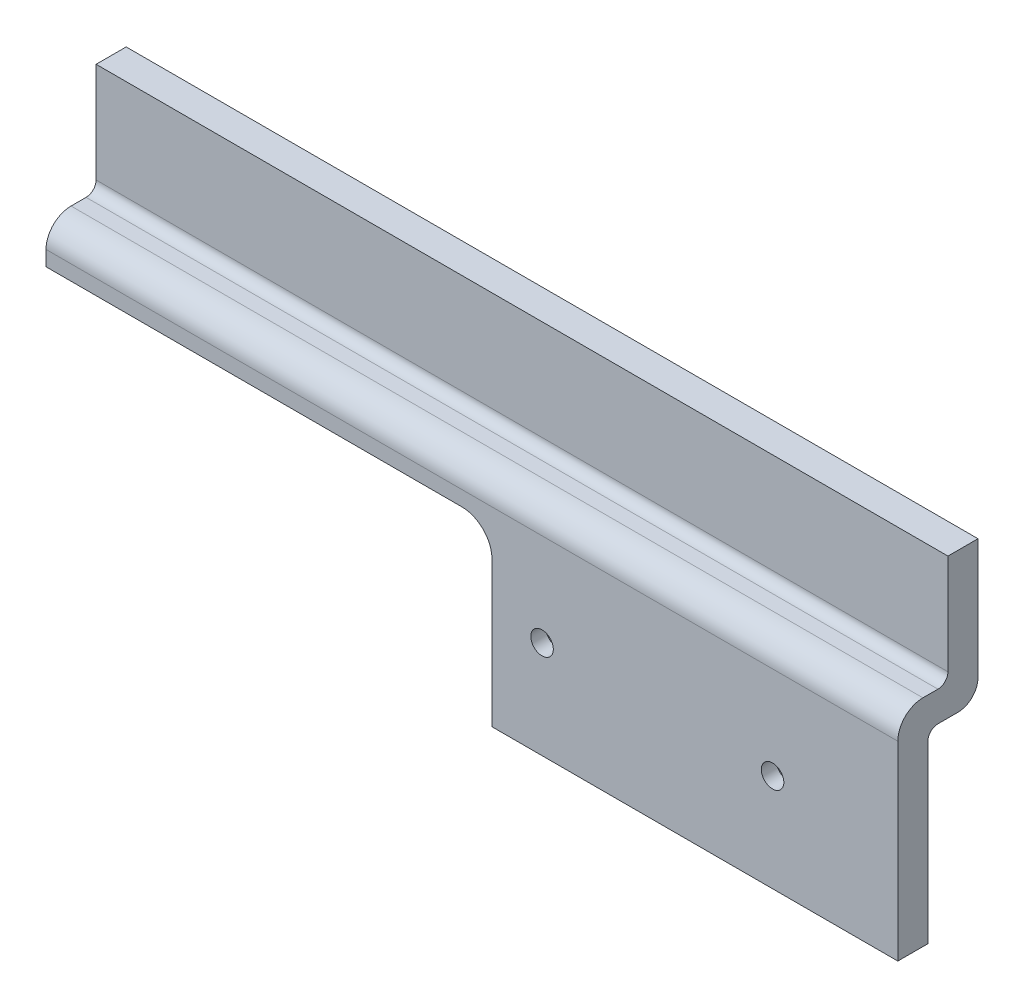
ISO-10303-21;
HEADER;
FILE_DESCRIPTION(('STEP AP214'),'2;1');
FILE_NAME('part.step','',(''),(''),'','','');
FILE_SCHEMA(('AUTOMOTIVE_DESIGN { 1 0 10303 214 1 1 1 1 }'));
ENDSEC;
DATA;
#1=APPLICATION_CONTEXT('core data for automotive mechanical design processes');
#2=APPLICATION_PROTOCOL_DEFINITION('international standard','automotive_design',2000,#1);
#3=PRODUCT_CONTEXT('',#1,'mechanical');
#4=PRODUCT('Part','Part','',(#3));
#5=PRODUCT_RELATED_PRODUCT_CATEGORY('part','',(#4));
#6=PRODUCT_DEFINITION_FORMATION('','',#4);
#7=PRODUCT_DEFINITION_CONTEXT('part definition',#1,'design');
#8=PRODUCT_DEFINITION('design','',#6,#7);
#9=PRODUCT_DEFINITION_SHAPE('','',#8);
#10=(LENGTH_UNIT() NAMED_UNIT(*) SI_UNIT(.MILLI.,.METRE.));
#11=(NAMED_UNIT(*) PLANE_ANGLE_UNIT() SI_UNIT($,.RADIAN.));
#12=(NAMED_UNIT(*) SI_UNIT($,.STERADIAN.) SOLID_ANGLE_UNIT());
#13=UNCERTAINTY_MEASURE_WITH_UNIT(LENGTH_MEASURE(1.E-05),#10,'distance_accuracy_value','');
#14=(GEOMETRIC_REPRESENTATION_CONTEXT(3) GLOBAL_UNCERTAINTY_ASSIGNED_CONTEXT((#13)) GLOBAL_UNIT_ASSIGNED_CONTEXT((#10,
#11,#12)) REPRESENTATION_CONTEXT('',''));
#15=CARTESIAN_POINT('',(0.,0.,0.));
#16=DIRECTION('',(0.,0.,1.));
#17=DIRECTION('',(1.,0.,0.));
#18=AXIS2_PLACEMENT_3D('',#15,#16,#17);
#19=CARTESIAN_POINT('',(170.,0.,0.));
#20=DIRECTION('',(0.,0.,1.));
#21=DIRECTION('',(1.,0.,0.));
#22=AXIS2_PLACEMENT_3D('',#19,#20,#21);
#23=PLANE('',#22);
#24=CARTESIAN_POINT('',(145.,19.5,0.));
#25=DIRECTION('',(0.,0.,-1.));
#26=DIRECTION('',(-1.,0.,0.));
#27=AXIS2_PLACEMENT_3D('',#24,#25,#26);
#28=CIRCLE('',#27,5.);
#29=CARTESIAN_POINT('',(140.,19.5,0.));
#30=VERTEX_POINT('',#29);
#31=EDGE_CURVE('E192',#30,#30,#28,.T.);
#32=ORIENTED_EDGE('',*,*,#31,.F.);
#33=EDGE_LOOP('',(#32));
#34=FACE_BOUND('',#33,.T.);
#35=DIRECTION('',(-1.,0.,0.));
#36=VECTOR('',#35,1.);
#37=CARTESIAN_POINT('',(170.,0.,0.));
#38=LINE('',#37,#36);
#39=CARTESIAN_POINT('',(170.,0.,0.));
#40=VERTEX_POINT('',#39);
#41=CARTESIAN_POINT('',(89.,0.,0.));
#42=VERTEX_POINT('',#41);
#43=EDGE_CURVE('E158',#40,#42,#38,.T.);
#44=ORIENTED_EDGE('',*,*,#43,.T.);
#45=DIRECTION('',(0.,-1.,0.));
#46=VECTOR('',#45,1.);
#47=CARTESIAN_POINT('',(89.,0.,0.));
#48=LINE('',#47,#46);
#49=CARTESIAN_POINT('',(89.,29.,0.));
#50=VERTEX_POINT('',#49);
#51=EDGE_CURVE('E142',#50,#42,#48,.T.);
#52=ORIENTED_EDGE('',*,*,#51,.F.);
#53=CARTESIAN_POINT('',(83.,29.,0.));
#54=DIRECTION('',(0.,0.,1.));
#55=DIRECTION('',(1.,0.,0.));
#56=AXIS2_PLACEMENT_3D('',#53,#54,#55);
#57=CIRCLE('',#56,6.);
#58=CARTESIAN_POINT('',(83.,35.,0.));
#59=VERTEX_POINT('',#58);
#60=EDGE_CURVE('E44',#50,#59,#57,.T.);
#61=ORIENTED_EDGE('',*,*,#60,.T.);
#62=DIRECTION('',(-1.,0.,0.));
#63=VECTOR('',#62,1.);
#64=CARTESIAN_POINT('',(170.,35.,0.));
#65=LINE('',#64,#63);
#66=CARTESIAN_POINT('',(170.,35.,0.));
#67=VERTEX_POINT('',#66);
#68=EDGE_CURVE('E51',#67,#59,#65,.T.);
#69=ORIENTED_EDGE('',*,*,#68,.F.);
#70=DIRECTION('',(0.,1.,0.));
#71=VECTOR('',#70,1.);
#72=CARTESIAN_POINT('',(170.,0.,0.));
#73=LINE('',#72,#71);
#74=EDGE_CURVE('E165',#40,#67,#73,.T.);
#75=ORIENTED_EDGE('',*,*,#74,.F.);
#76=EDGE_LOOP('',(#44,#52,#61,#69,#75));
#77=FACE_BOUND('',#76,.T.);
#78=CARTESIAN_POINT('',(99.,19.5,0.));
#79=DIRECTION('',(0.,0.,-1.));
#80=DIRECTION('',(-1.,0.,0.));
#81=AXIS2_PLACEMENT_3D('',#78,#79,#80);
#82=CIRCLE('',#81,4.99999999999999);
#83=CARTESIAN_POINT('',(94.,19.5,0.));
#84=VERTEX_POINT('',#83);
#85=EDGE_CURVE('E181',#84,#84,#82,.T.);
#86=ORIENTED_EDGE('',*,*,#85,.F.);
#87=EDGE_LOOP('',(#86));
#88=FACE_BOUND('',#87,.T.);
#89=ADVANCED_FACE('F36',(#34,#77,#88),#23,.F.);
#90=CARTESIAN_POINT('',(170.,0.,6.));
#91=DIRECTION('',(0.,0.,-1.));
#92=DIRECTION('',(-1.,0.,0.));
#93=AXIS2_PLACEMENT_3D('',#90,#91,#92);
#94=PLANE('',#93);
#95=CARTESIAN_POINT('',(145.,19.5,6.));
#96=DIRECTION('',(0.,0.,-1.));
#97=DIRECTION('',(-1.,0.,0.));
#98=AXIS2_PLACEMENT_3D('',#95,#96,#97);
#99=CIRCLE('',#98,2.25);
#100=CARTESIAN_POINT('',(142.75,19.5,6.));
#101=VERTEX_POINT('',#100);
#102=EDGE_CURVE('E178',#101,#101,#99,.T.);
#103=ORIENTED_EDGE('',*,*,#102,.T.);
#104=EDGE_LOOP('',(#103));
#105=FACE_BOUND('',#104,.T.);
#106=CARTESIAN_POINT('',(99.,19.5,6.));
#107=DIRECTION('',(0.,0.,-1.));
#108=DIRECTION('',(-1.,0.,0.));
#109=AXIS2_PLACEMENT_3D('',#106,#107,#108);
#110=CIRCLE('',#109,2.24999999999999);
#111=CARTESIAN_POINT('',(96.75,19.5,6.));
#112=VERTEX_POINT('',#111);
#113=EDGE_CURVE('E173',#112,#112,#110,.T.);
#114=ORIENTED_EDGE('',*,*,#113,.T.);
#115=EDGE_LOOP('',(#114));
#116=FACE_BOUND('',#115,.T.);
#117=DIRECTION('',(1.,0.,0.));
#118=VECTOR('',#117,1.);
#119=CARTESIAN_POINT('',(170.,35.,6.));
#120=LINE('',#119,#118);
#121=CARTESIAN_POINT('',(0.,35.,6.));
#122=VERTEX_POINT('',#121);
#123=CARTESIAN_POINT('',(83.,35.,6.));
#124=VERTEX_POINT('',#123);
#125=EDGE_CURVE('E162',#122,#124,#120,.T.);
#126=ORIENTED_EDGE('',*,*,#125,.T.);
#127=CARTESIAN_POINT('',(83.,29.,6.00000000000001));
#128=DIRECTION('',(0.,0.,-1.));
#129=DIRECTION('',(-1.,0.,0.));
#130=AXIS2_PLACEMENT_3D('',#127,#128,#129);
#131=CIRCLE('',#130,6.);
#132=CARTESIAN_POINT('',(89.,29.,6.));
#133=VERTEX_POINT('',#132);
#134=EDGE_CURVE('E11',#124,#133,#131,.T.);
#135=ORIENTED_EDGE('',*,*,#134,.T.);
#136=DIRECTION('',(0.,-1.,0.));
#137=VECTOR('',#136,1.);
#138=CARTESIAN_POINT('',(89.,0.,6.));
#139=LINE('',#138,#137);
#140=CARTESIAN_POINT('',(89.,0.,6.00000000000001));
#141=VERTEX_POINT('',#140);
#142=EDGE_CURVE('E190',#133,#141,#139,.T.);
#143=ORIENTED_EDGE('',*,*,#142,.T.);
#144=DIRECTION('',(-1.,0.,0.));
#145=VECTOR('',#144,1.);
#146=CARTESIAN_POINT('',(170.,0.,6.));
#147=LINE('',#146,#145);
#148=CARTESIAN_POINT('',(170.,0.,6.));
#149=VERTEX_POINT('',#148);
#150=EDGE_CURVE('E161',#149,#141,#147,.T.);
#151=ORIENTED_EDGE('',*,*,#150,.F.);
#152=DIRECTION('',(0.,-1.,0.));
#153=VECTOR('',#152,1.);
#154=CARTESIAN_POINT('',(170.,0.,6.));
#155=LINE('',#154,#153);
#156=CARTESIAN_POINT('',(170.,38.,6.));
#157=VERTEX_POINT('',#156);
#158=EDGE_CURVE('E210',#157,#149,#155,.T.);
#159=ORIENTED_EDGE('',*,*,#158,.F.);
#160=DIRECTION('',(-1.,0.,0.));
#161=VECTOR('',#160,1.);
#162=CARTESIAN_POINT('',(170.,38.,6.));
#163=LINE('',#162,#161);
#164=CARTESIAN_POINT('',(0.,38.,6.));
#165=VERTEX_POINT('',#164);
#166=EDGE_CURVE('E235',#157,#165,#163,.T.);
#167=ORIENTED_EDGE('',*,*,#166,.T.);
#168=DIRECTION('',(0.,-1.,0.));
#169=VECTOR('',#168,1.);
#170=CARTESIAN_POINT('',(0.,0.,6.));
#171=LINE('',#170,#169);
#172=EDGE_CURVE('E176',#165,#122,#171,.T.);
#173=ORIENTED_EDGE('',*,*,#172,.T.);
#174=EDGE_LOOP('',(#126,#135,#143,#151,#159,#167,#173));
#175=FACE_BOUND('',#174,.T.);
#176=ADVANCED_FACE('F189',(#105,#116,#175),#94,.F.);
#177=CARTESIAN_POINT('',(170.,0.,6.));
#178=DIRECTION('',(0.,1.,0.));
#179=DIRECTION('',(0.,0.,1.));
#180=AXIS2_PLACEMENT_3D('',#177,#178,#179);
#181=PLANE('',#180);
#182=ORIENTED_EDGE('',*,*,#150,.T.);
#183=DIRECTION('',(0.,0.,-1.));
#184=VECTOR('',#183,1.);
#185=CARTESIAN_POINT('',(89.,0.,100.));
#186=LINE('',#185,#184);
#187=EDGE_CURVE('E146',#141,#42,#186,.T.);
#188=ORIENTED_EDGE('',*,*,#187,.T.);
#189=ORIENTED_EDGE('',*,*,#43,.F.);
#190=DIRECTION('',(0.,0.,-1.));
#191=VECTOR('',#190,1.);
#192=CARTESIAN_POINT('',(170.,0.,6.));
#193=LINE('',#192,#191);
#194=EDGE_CURVE('E213',#149,#40,#193,.T.);
#195=ORIENTED_EDGE('',*,*,#194,.F.);
#196=EDGE_LOOP('',(#182,#188,#189,#195));
#197=FACE_BOUND('',#196,.T.);
#198=ADVANCED_FACE('F157',(#197),#181,.F.);
#199=CARTESIAN_POINT('',(170.,35.,-2.));
#200=DIRECTION('',(-1.,0.,0.));
#201=DIRECTION('',(0.,0.,1.));
#202=AXIS2_PLACEMENT_3D('',#199,#200,#201);
#203=CYLINDRICAL_SURFACE('',#202,2.);
#204=CARTESIAN_POINT('',(0.,35.,-2.));
#205=DIRECTION('',(-1.,0.,0.));
#206=DIRECTION('',(0.,0.,-1.));
#207=AXIS2_PLACEMENT_3D('',#204,#205,#206);
#208=CIRCLE('',#207,2.);
#209=CARTESIAN_POINT('',(0.,35.,0.));
#210=VERTEX_POINT('',#209);
#211=CARTESIAN_POINT('',(0.,37.,-2.00000000000002));
#212=VERTEX_POINT('',#211);
#213=EDGE_CURVE('E237',#210,#212,#208,.T.);
#214=ORIENTED_EDGE('',*,*,#213,.T.);
#215=DIRECTION('',(-1.,0.,0.));
#216=VECTOR('',#215,1.);
#217=CARTESIAN_POINT('',(170.,37.,-2.00000000000002));
#218=LINE('',#217,#216);
#219=CARTESIAN_POINT('',(170.,37.,-2.00000000000002));
#220=VERTEX_POINT('',#219);
#221=EDGE_CURVE('E169',#220,#212,#218,.T.);
#222=ORIENTED_EDGE('',*,*,#221,.F.);
#223=CARTESIAN_POINT('',(170.,35.,-2.));
#224=DIRECTION('',(-1.,0.,0.));
#225=DIRECTION('',(0.,0.,-1.));
#226=AXIS2_PLACEMENT_3D('',#223,#224,#225);
#227=CIRCLE('',#226,2.);
#228=EDGE_CURVE('E217',#67,#220,#227,.T.);
#229=ORIENTED_EDGE('',*,*,#228,.F.);
#230=ORIENTED_EDGE('',*,*,#68,.T.);
#231=DIRECTION('',(1.,0.,0.));
#232=VECTOR('',#231,1.);
#233=CARTESIAN_POINT('',(89.,35.,0.));
#234=LINE('',#233,#232);
#235=EDGE_CURVE('E153',#210,#59,#234,.T.);
#236=ORIENTED_EDGE('',*,*,#235,.F.);
#237=EDGE_LOOP('',(#214,#222,#229,#230,#236));
#238=FACE_BOUND('',#237,.T.);
#239=ADVANCED_FACE('F301',(#238),#203,.F.);
#240=CARTESIAN_POINT('',(170.,37.,-5.99999999999997));
#241=DIRECTION('',(0.,1.,0.));
#242=DIRECTION('',(0.,0.,1.));
#243=AXIS2_PLACEMENT_3D('',#240,#241,#242);
#244=PLANE('',#243);
#245=DIRECTION('',(0.,0.,-1.));
#246=VECTOR('',#245,1.);
#247=CARTESIAN_POINT('',(0.,37.,-5.99999999999997));
#248=LINE('',#247,#246);
#249=CARTESIAN_POINT('',(0.,37.,-5.99999999999997));
#250=VERTEX_POINT('',#249);
#251=EDGE_CURVE('E239',#212,#250,#248,.T.);
#252=ORIENTED_EDGE('',*,*,#251,.T.);
#253=DIRECTION('',(-1.,0.,0.));
#254=VECTOR('',#253,1.);
#255=CARTESIAN_POINT('',(170.,37.,-5.99999999999997));
#256=LINE('',#255,#254);
#257=CARTESIAN_POINT('',(170.,37.,-5.99999999999997));
#258=VERTEX_POINT('',#257);
#259=EDGE_CURVE('E274',#258,#250,#256,.T.);
#260=ORIENTED_EDGE('',*,*,#259,.F.);
#261=DIRECTION('',(0.,0.,-1.));
#262=VECTOR('',#261,1.);
#263=CARTESIAN_POINT('',(170.,37.,-5.99999999999997));
#264=LINE('',#263,#262);
#265=EDGE_CURVE('E219',#220,#258,#264,.T.);
#266=ORIENTED_EDGE('',*,*,#265,.F.);
#267=ORIENTED_EDGE('',*,*,#221,.T.);
#268=EDGE_LOOP('',(#252,#260,#266,#267));
#269=FACE_BOUND('',#268,.T.);
#270=ADVANCED_FACE('F281',(#269),#244,.F.);
#271=CARTESIAN_POINT('',(170.,41.,-6.));
#272=DIRECTION('',(-1.,0.,0.));
#273=DIRECTION('',(0.,0.,1.));
#274=AXIS2_PLACEMENT_3D('',#271,#272,#273);
#275=CYLINDRICAL_SURFACE('',#274,4.);
#276=CARTESIAN_POINT('',(0.,41.,-6.));
#277=DIRECTION('',(1.,0.,0.));
#278=DIRECTION('',(0.,0.,1.));
#279=AXIS2_PLACEMENT_3D('',#276,#277,#278);
#280=CIRCLE('',#279,4.);
#281=CARTESIAN_POINT('',(0.,41.,-10.));
#282=VERTEX_POINT('',#281);
#283=EDGE_CURVE('E241',#250,#282,#280,.T.);
#284=ORIENTED_EDGE('',*,*,#283,.T.);
#285=DIRECTION('',(-1.,0.,0.));
#286=VECTOR('',#285,1.);
#287=CARTESIAN_POINT('',(170.,41.,-10.));
#288=LINE('',#287,#286);
#289=CARTESIAN_POINT('',(170.,41.,-10.));
#290=VERTEX_POINT('',#289);
#291=EDGE_CURVE('E271',#290,#282,#288,.T.);
#292=ORIENTED_EDGE('',*,*,#291,.F.);
#293=CARTESIAN_POINT('',(170.,41.,-6.));
#294=DIRECTION('',(1.,0.,0.));
#295=DIRECTION('',(0.,0.,1.));
#296=AXIS2_PLACEMENT_3D('',#293,#294,#295);
#297=CIRCLE('',#296,4.);
#298=EDGE_CURVE('E221',#258,#290,#297,.T.);
#299=ORIENTED_EDGE('',*,*,#298,.F.);
#300=ORIENTED_EDGE('',*,*,#259,.T.);
#301=EDGE_LOOP('',(#284,#292,#299,#300));
#302=FACE_BOUND('',#301,.T.);
#303=ADVANCED_FACE('F291',(#302),#275,.T.);
#304=CARTESIAN_POINT('',(170.,65.,-10.));
#305=DIRECTION('',(0.,0.,1.));
#306=DIRECTION('',(0.,-1.,0.));
#307=AXIS2_PLACEMENT_3D('',#304,#305,#306);
#308=PLANE('',#307);
#309=DIRECTION('',(0.,1.,0.));
#310=VECTOR('',#309,1.);
#311=CARTESIAN_POINT('',(0.,65.,-10.));
#312=LINE('',#311,#310);
#313=CARTESIAN_POINT('',(0.,65.,-10.));
#314=VERTEX_POINT('',#313);
#315=EDGE_CURVE('E243',#282,#314,#312,.T.);
#316=ORIENTED_EDGE('',*,*,#315,.T.);
#317=DIRECTION('',(-1.,0.,0.));
#318=VECTOR('',#317,1.);
#319=CARTESIAN_POINT('',(170.,65.,-10.));
#320=LINE('',#319,#318);
#321=CARTESIAN_POINT('',(170.,65.,-10.));
#322=VERTEX_POINT('',#321);
#323=EDGE_CURVE('E268',#322,#314,#320,.T.);
#324=ORIENTED_EDGE('',*,*,#323,.F.);
#325=DIRECTION('',(0.,1.,0.));
#326=VECTOR('',#325,1.);
#327=CARTESIAN_POINT('',(170.,65.,-10.));
#328=LINE('',#327,#326);
#329=EDGE_CURVE('E223',#290,#322,#328,.T.);
#330=ORIENTED_EDGE('',*,*,#329,.F.);
#331=ORIENTED_EDGE('',*,*,#291,.T.);
#332=EDGE_LOOP('',(#316,#324,#330,#331));
#333=FACE_BOUND('',#332,.T.);
#334=ADVANCED_FACE('F295',(#333),#308,.F.);
#335=CARTESIAN_POINT('',(170.,65.,-4.));
#336=DIRECTION('',(0.,-1.,0.));
#337=DIRECTION('',(0.,0.,-1.));
#338=AXIS2_PLACEMENT_3D('',#335,#336,#337);
#339=PLANE('',#338);
#340=DIRECTION('',(0.,0.,1.));
#341=VECTOR('',#340,1.);
#342=CARTESIAN_POINT('',(0.,65.,-4.));
#343=LINE('',#342,#341);
#344=CARTESIAN_POINT('',(0.,65.,-4.));
#345=VERTEX_POINT('',#344);
#346=EDGE_CURVE('E245',#314,#345,#343,.T.);
#347=ORIENTED_EDGE('',*,*,#346,.T.);
#348=DIRECTION('',(-1.,0.,0.));
#349=VECTOR('',#348,1.);
#350=CARTESIAN_POINT('',(170.,65.,-4.));
#351=LINE('',#350,#349);
#352=CARTESIAN_POINT('',(170.,65.,-4.));
#353=VERTEX_POINT('',#352);
#354=EDGE_CURVE('E265',#353,#345,#351,.T.);
#355=ORIENTED_EDGE('',*,*,#354,.F.);
#356=DIRECTION('',(0.,0.,1.));
#357=VECTOR('',#356,1.);
#358=CARTESIAN_POINT('',(170.,65.,-4.));
#359=LINE('',#358,#357);
#360=EDGE_CURVE('E225',#322,#353,#359,.T.);
#361=ORIENTED_EDGE('',*,*,#360,.F.);
#362=ORIENTED_EDGE('',*,*,#323,.T.);
#363=EDGE_LOOP('',(#347,#355,#361,#362));
#364=FACE_BOUND('',#363,.T.);
#365=ADVANCED_FACE('F370',(#364),#339,.F.);
#366=CARTESIAN_POINT('',(170.,45.,-4.));
#367=DIRECTION('',(0.,0.,-1.));
#368=DIRECTION('',(0.,1.,0.));
#369=AXIS2_PLACEMENT_3D('',#366,#367,#368);
#370=PLANE('',#369);
#371=DIRECTION('',(0.,-1.,0.));
#372=VECTOR('',#371,1.);
#373=CARTESIAN_POINT('',(0.,45.,-4.));
#374=LINE('',#373,#372);
#375=CARTESIAN_POINT('',(0.,45.,-4.));
#376=VERTEX_POINT('',#375);
#377=EDGE_CURVE('E247',#345,#376,#374,.T.);
#378=ORIENTED_EDGE('',*,*,#377,.T.);
#379=DIRECTION('',(-1.,0.,0.));
#380=VECTOR('',#379,1.);
#381=CARTESIAN_POINT('',(170.,45.,-4.));
#382=LINE('',#381,#380);
#383=CARTESIAN_POINT('',(170.,45.,-4.));
#384=VERTEX_POINT('',#383);
#385=EDGE_CURVE('E262',#384,#376,#382,.T.);
#386=ORIENTED_EDGE('',*,*,#385,.F.);
#387=DIRECTION('',(0.,-1.,0.));
#388=VECTOR('',#387,1.);
#389=CARTESIAN_POINT('',(170.,45.,-4.));
#390=LINE('',#389,#388);
#391=EDGE_CURVE('E227',#353,#384,#390,.T.);
#392=ORIENTED_EDGE('',*,*,#391,.F.);
#393=ORIENTED_EDGE('',*,*,#354,.T.);
#394=EDGE_LOOP('',(#378,#386,#392,#393));
#395=FACE_BOUND('',#394,.T.);
#396=ADVANCED_FACE('F366',(#395),#370,.F.);
#397=CARTESIAN_POINT('',(170.,45.,-2.));
#398=DIRECTION('',(-1.,0.,0.));
#399=DIRECTION('',(0.,0.,1.));
#400=AXIS2_PLACEMENT_3D('',#397,#398,#399);
#401=CYLINDRICAL_SURFACE('',#400,2.);
#402=CARTESIAN_POINT('',(0.,45.,-2.));
#403=DIRECTION('',(-1.,0.,0.));
#404=DIRECTION('',(0.,0.,1.));
#405=AXIS2_PLACEMENT_3D('',#402,#403,#404);
#406=CIRCLE('',#405,2.);
#407=CARTESIAN_POINT('',(0.,43.,-1.99999999999999));
#408=VERTEX_POINT('',#407);
#409=EDGE_CURVE('E249',#376,#408,#406,.T.);
#410=ORIENTED_EDGE('',*,*,#409,.T.);
#411=DIRECTION('',(-1.,0.,0.));
#412=VECTOR('',#411,1.);
#413=CARTESIAN_POINT('',(170.,43.,-1.99999999999999));
#414=LINE('',#413,#412);
#415=CARTESIAN_POINT('',(170.,43.,-1.99999999999999));
#416=VERTEX_POINT('',#415);
#417=EDGE_CURVE('E259',#416,#408,#414,.T.);
#418=ORIENTED_EDGE('',*,*,#417,.F.);
#419=CARTESIAN_POINT('',(170.,45.,-2.));
#420=DIRECTION('',(-1.,0.,0.));
#421=DIRECTION('',(0.,0.,1.));
#422=AXIS2_PLACEMENT_3D('',#419,#420,#421);
#423=CIRCLE('',#422,2.);
#424=EDGE_CURVE('E229',#384,#416,#423,.T.);
#425=ORIENTED_EDGE('',*,*,#424,.F.);
#426=ORIENTED_EDGE('',*,*,#385,.T.);
#427=EDGE_LOOP('',(#410,#418,#425,#426));
#428=FACE_BOUND('',#427,.T.);
#429=ADVANCED_FACE('F362',(#428),#401,.F.);
#430=CARTESIAN_POINT('',(170.,43.,0.999999999999964));
#431=DIRECTION('',(0.,-1.,0.));
#432=DIRECTION('',(0.,0.,-1.));
#433=AXIS2_PLACEMENT_3D('',#430,#431,#432);
#434=PLANE('',#433);
#435=DIRECTION('',(0.,0.,1.));
#436=VECTOR('',#435,1.);
#437=CARTESIAN_POINT('',(0.,43.,0.999999999999964));
#438=LINE('',#437,#436);
#439=CARTESIAN_POINT('',(0.,43.,0.999999999999964));
#440=VERTEX_POINT('',#439);
#441=EDGE_CURVE('E251',#408,#440,#438,.T.);
#442=ORIENTED_EDGE('',*,*,#441,.T.);
#443=DIRECTION('',(-1.,0.,0.));
#444=VECTOR('',#443,1.);
#445=CARTESIAN_POINT('',(170.,43.,0.999999999999964));
#446=LINE('',#445,#444);
#447=CARTESIAN_POINT('',(170.,43.,0.999999999999964));
#448=VERTEX_POINT('',#447);
#449=EDGE_CURVE('E256',#448,#440,#446,.T.);
#450=ORIENTED_EDGE('',*,*,#449,.F.);
#451=DIRECTION('',(0.,0.,1.));
#452=VECTOR('',#451,1.);
#453=CARTESIAN_POINT('',(170.,43.,0.999999999999964));
#454=LINE('',#453,#452);
#455=EDGE_CURVE('E231',#416,#448,#454,.T.);
#456=ORIENTED_EDGE('',*,*,#455,.F.);
#457=ORIENTED_EDGE('',*,*,#417,.T.);
#458=EDGE_LOOP('',(#442,#450,#456,#457));
#459=FACE_BOUND('',#458,.T.);
#460=ADVANCED_FACE('F358',(#459),#434,.F.);
#461=CARTESIAN_POINT('',(170.,38.,1.));
#462=DIRECTION('',(-1.,0.,0.));
#463=DIRECTION('',(0.,0.,1.));
#464=AXIS2_PLACEMENT_3D('',#461,#462,#463);
#465=CYLINDRICAL_SURFACE('',#464,5.);
#466=CARTESIAN_POINT('',(0.,38.,1.));
#467=DIRECTION('',(1.,0.,0.));
#468=DIRECTION('',(0.,0.,-1.));
#469=AXIS2_PLACEMENT_3D('',#466,#467,#468);
#470=CIRCLE('',#469,5.);
#471=EDGE_CURVE('E214',#440,#165,#470,.T.);
#472=ORIENTED_EDGE('',*,*,#471,.T.);
#473=ORIENTED_EDGE('',*,*,#166,.F.);
#474=CARTESIAN_POINT('',(170.,38.,1.));
#475=DIRECTION('',(1.,0.,0.));
#476=DIRECTION('',(0.,0.,-1.));
#477=AXIS2_PLACEMENT_3D('',#474,#475,#476);
#478=CIRCLE('',#477,5.);
#479=EDGE_CURVE('E233',#448,#157,#478,.T.);
#480=ORIENTED_EDGE('',*,*,#479,.F.);
#481=ORIENTED_EDGE('',*,*,#449,.T.);
#482=EDGE_LOOP('',(#472,#473,#480,#481));
#483=FACE_BOUND('',#482,.T.);
#484=ADVANCED_FACE('F353',(#483),#465,.T.);
#485=CARTESIAN_POINT('',(170.,38.,1.));
#486=DIRECTION('',(1.,0.,0.));
#487=DIRECTION('',(0.,0.,-1.));
#488=AXIS2_PLACEMENT_3D('',#485,#486,#487);
#489=PLANE('',#488);
#490=ORIENTED_EDGE('',*,*,#158,.T.);
#491=ORIENTED_EDGE('',*,*,#194,.T.);
#492=ORIENTED_EDGE('',*,*,#74,.T.);
#493=ORIENTED_EDGE('',*,*,#228,.T.);
#494=ORIENTED_EDGE('',*,*,#265,.T.);
#495=ORIENTED_EDGE('',*,*,#298,.T.);
#496=ORIENTED_EDGE('',*,*,#329,.T.);
#497=ORIENTED_EDGE('',*,*,#360,.T.);
#498=ORIENTED_EDGE('',*,*,#391,.T.);
#499=ORIENTED_EDGE('',*,*,#424,.T.);
#500=ORIENTED_EDGE('',*,*,#455,.T.);
#501=ORIENTED_EDGE('',*,*,#479,.T.);
#502=EDGE_LOOP('',(#490,#491,#492,#493,#494,#495,#496,#497,#498,#499,#500,#501));
#503=FACE_BOUND('',#502,.T.);
#504=ADVANCED_FACE('F299',(#503),#489,.T.);
#505=CARTESIAN_POINT('',(0.,38.,1.));
#506=DIRECTION('',(1.,0.,0.));
#507=DIRECTION('',(0.,0.,-1.));
#508=AXIS2_PLACEMENT_3D('',#505,#506,#507);
#509=PLANE('',#508);
#510=ORIENTED_EDGE('',*,*,#213,.F.);
#511=DIRECTION('',(0.,0.,1.));
#512=VECTOR('',#511,1.);
#513=CARTESIAN_POINT('',(0.,35.,1.));
#514=LINE('',#513,#512);
#515=EDGE_CURVE('E167',#210,#122,#514,.T.);
#516=ORIENTED_EDGE('',*,*,#515,.T.);
#517=ORIENTED_EDGE('',*,*,#172,.F.);
#518=ORIENTED_EDGE('',*,*,#471,.F.);
#519=ORIENTED_EDGE('',*,*,#441,.F.);
#520=ORIENTED_EDGE('',*,*,#409,.F.);
#521=ORIENTED_EDGE('',*,*,#377,.F.);
#522=ORIENTED_EDGE('',*,*,#346,.F.);
#523=ORIENTED_EDGE('',*,*,#315,.F.);
#524=ORIENTED_EDGE('',*,*,#283,.F.);
#525=ORIENTED_EDGE('',*,*,#251,.F.);
#526=EDGE_LOOP('',(#510,#516,#517,#518,#519,#520,#521,#522,#523,#524,#525));
#527=FACE_BOUND('',#526,.T.);
#528=ADVANCED_FACE('F286',(#527),#509,.F.);
#529=CARTESIAN_POINT('',(99.,19.5,0.));
#530=DIRECTION('',(0.,0.,-1.));
#531=DIRECTION('',(-1.,0.,0.));
#532=AXIS2_PLACEMENT_3D('',#529,#530,#531);
#533=CYLINDRICAL_SURFACE('',#532,2.24999999999999);
#534=CARTESIAN_POINT('',(99.,19.5,3.));
#535=DIRECTION('',(0.,0.,-1.));
#536=DIRECTION('',(-1.,0.,0.));
#537=AXIS2_PLACEMENT_3D('',#534,#535,#536);
#538=CIRCLE('',#537,2.24999999999999);
#539=CARTESIAN_POINT('',(96.75,19.5,3.));
#540=VERTEX_POINT('',#539);
#541=EDGE_CURVE('E177',#540,#540,#538,.T.);
#542=ORIENTED_EDGE('',*,*,#541,.T.);
#543=EDGE_LOOP('',(#542));
#544=FACE_BOUND('',#543,.T.);
#545=ORIENTED_EDGE('',*,*,#113,.F.);
#546=EDGE_LOOP('',(#545));
#547=FACE_BOUND('',#546,.T.);
#548=ADVANCED_FACE('F346',(#544,#547),#533,.F.);
#549=CARTESIAN_POINT('',(101.25,19.5,3.));
#550=DIRECTION('',(0.,0.,1.));
#551=DIRECTION('',(1.,0.,0.));
#552=AXIS2_PLACEMENT_3D('',#549,#550,#551);
#553=PLANE('',#552);
#554=ORIENTED_EDGE('',*,*,#541,.F.);
#555=EDGE_LOOP('',(#554));
#556=FACE_BOUND('',#555,.T.);
#557=CARTESIAN_POINT('',(99.,19.5,3.));
#558=DIRECTION('',(0.,0.,-1.));
#559=DIRECTION('',(-1.,0.,0.));
#560=AXIS2_PLACEMENT_3D('',#557,#558,#559);
#561=CIRCLE('',#560,4.99999999999999);
#562=CARTESIAN_POINT('',(94.,19.5,3.));
#563=VERTEX_POINT('',#562);
#564=EDGE_CURVE('E205',#563,#563,#561,.T.);
#565=ORIENTED_EDGE('',*,*,#564,.T.);
#566=EDGE_LOOP('',(#565));
#567=FACE_BOUND('',#566,.T.);
#568=ADVANCED_FACE('F342',(#556,#567),#553,.F.);
#569=CARTESIAN_POINT('',(99.,19.5,0.));
#570=DIRECTION('',(0.,0.,-1.));
#571=DIRECTION('',(-1.,0.,0.));
#572=AXIS2_PLACEMENT_3D('',#569,#570,#571);
#573=CYLINDRICAL_SURFACE('',#572,4.99999999999999);
#574=ORIENTED_EDGE('',*,*,#564,.F.);
#575=EDGE_LOOP('',(#574));
#576=FACE_BOUND('',#575,.T.);
#577=ORIENTED_EDGE('',*,*,#85,.T.);
#578=EDGE_LOOP('',(#577));
#579=FACE_BOUND('',#578,.T.);
#580=ADVANCED_FACE('F338',(#576,#579),#573,.F.);
#581=CARTESIAN_POINT('',(145.,19.5,0.));
#582=DIRECTION('',(0.,0.,-1.));
#583=DIRECTION('',(-1.,0.,0.));
#584=AXIS2_PLACEMENT_3D('',#581,#582,#583);
#585=CYLINDRICAL_SURFACE('',#584,2.25);
#586=CARTESIAN_POINT('',(145.,19.5,3.));
#587=DIRECTION('',(0.,0.,-1.));
#588=DIRECTION('',(-1.,0.,0.));
#589=AXIS2_PLACEMENT_3D('',#586,#587,#588);
#590=CIRCLE('',#589,2.25);
#591=CARTESIAN_POINT('',(142.75,19.5,3.));
#592=VERTEX_POINT('',#591);
#593=EDGE_CURVE('E182',#592,#592,#590,.T.);
#594=ORIENTED_EDGE('',*,*,#593,.T.);
#595=EDGE_LOOP('',(#594));
#596=FACE_BOUND('',#595,.T.);
#597=ORIENTED_EDGE('',*,*,#102,.F.);
#598=EDGE_LOOP('',(#597));
#599=FACE_BOUND('',#598,.T.);
#600=ADVANCED_FACE('F330',(#596,#599),#585,.F.);
#601=CARTESIAN_POINT('',(147.25,19.5,3.));
#602=DIRECTION('',(0.,0.,1.));
#603=DIRECTION('',(1.,0.,0.));
#604=AXIS2_PLACEMENT_3D('',#601,#602,#603);
#605=PLANE('',#604);
#606=ORIENTED_EDGE('',*,*,#593,.F.);
#607=EDGE_LOOP('',(#606));
#608=FACE_BOUND('',#607,.T.);
#609=CARTESIAN_POINT('',(145.,19.5,3.));
#610=DIRECTION('',(0.,0.,-1.));
#611=DIRECTION('',(-1.,0.,0.));
#612=AXIS2_PLACEMENT_3D('',#609,#610,#611);
#613=CIRCLE('',#612,5.);
#614=CARTESIAN_POINT('',(140.,19.5,3.));
#615=VERTEX_POINT('',#614);
#616=EDGE_CURVE('E195',#615,#615,#613,.T.);
#617=ORIENTED_EDGE('',*,*,#616,.T.);
#618=EDGE_LOOP('',(#617));
#619=FACE_BOUND('',#618,.T.);
#620=ADVANCED_FACE('F321',(#608,#619),#605,.F.);
#621=CARTESIAN_POINT('',(145.,19.5,0.));
#622=DIRECTION('',(0.,0.,-1.));
#623=DIRECTION('',(-1.,0.,0.));
#624=AXIS2_PLACEMENT_3D('',#621,#622,#623);
#625=CYLINDRICAL_SURFACE('',#624,5.);
#626=ORIENTED_EDGE('',*,*,#616,.F.);
#627=EDGE_LOOP('',(#626));
#628=FACE_BOUND('',#627,.T.);
#629=ORIENTED_EDGE('',*,*,#31,.T.);
#630=EDGE_LOOP('',(#629));
#631=FACE_BOUND('',#630,.T.);
#632=ADVANCED_FACE('F319',(#628,#631),#625,.F.);
#633=CARTESIAN_POINT('',(89.,0.,100.));
#634=DIRECTION('',(1.,0.,0.));
#635=DIRECTION('',(0.,0.,-1.));
#636=AXIS2_PLACEMENT_3D('',#633,#634,#635);
#637=PLANE('',#636);
#638=ORIENTED_EDGE('',*,*,#142,.F.);
#639=DIRECTION('',(0.,0.,-1.));
#640=VECTOR('',#639,1.);
#641=CARTESIAN_POINT('',(89.,29.,0.));
#642=LINE('',#641,#640);
#643=EDGE_CURVE('E149',#133,#50,#642,.T.);
#644=ORIENTED_EDGE('',*,*,#643,.T.);
#645=ORIENTED_EDGE('',*,*,#51,.T.);
#646=ORIENTED_EDGE('',*,*,#187,.F.);
#647=EDGE_LOOP('',(#638,#644,#645,#646));
#648=FACE_BOUND('',#647,.T.);
#649=ADVANCED_FACE('F145',(#648),#637,.F.);
#650=CARTESIAN_POINT('',(89.,35.,100.));
#651=DIRECTION('',(0.,1.,0.));
#652=DIRECTION('',(0.,0.,1.));
#653=AXIS2_PLACEMENT_3D('',#650,#651,#652);
#654=PLANE('',#653);
#655=ORIENTED_EDGE('',*,*,#235,.T.);
#656=DIRECTION('',(0.,0.,-1.));
#657=VECTOR('',#656,1.);
#658=CARTESIAN_POINT('',(83.,35.,6.00000000000001));
#659=LINE('',#658,#657);
#660=EDGE_CURVE('E58',#59,#124,#659,.F.);
#661=ORIENTED_EDGE('',*,*,#660,.T.);
#662=ORIENTED_EDGE('',*,*,#125,.F.);
#663=ORIENTED_EDGE('',*,*,#515,.F.);
#664=EDGE_LOOP('',(#655,#661,#662,#663));
#665=FACE_BOUND('',#664,.T.);
#666=ADVANCED_FACE('F328',(#665),#654,.F.);
#667=CARTESIAN_POINT('',(83.,29.,100.));
#668=DIRECTION('',(0.,0.,1.));
#669=DIRECTION('',(1.,0.,0.));
#670=AXIS2_PLACEMENT_3D('',#667,#668,#669);
#671=CYLINDRICAL_SURFACE('',#670,6.);
#672=ORIENTED_EDGE('',*,*,#134,.F.);
#673=ORIENTED_EDGE('',*,*,#660,.F.);
#674=ORIENTED_EDGE('',*,*,#60,.F.);
#675=ORIENTED_EDGE('',*,*,#643,.F.);
#676=EDGE_LOOP('',(#672,#673,#674,#675));
#677=FACE_BOUND('',#676,.T.);
#678=ADVANCED_FACE('F38',(#677),#671,.F.);
#679=CLOSED_SHELL('',(#89,#176,#198,#239,#270,#303,#334,#365,#396,#429,#460,#484,#504,#528,#548,
#568,#580,#600,#620,#632,#649,#666,#678));
#680=MANIFOLD_SOLID_BREP('B2',#679);
#681=ADVANCED_BREP_SHAPE_REPRESENTATION('',(#18,#680),#14);
#682=SHAPE_DEFINITION_REPRESENTATION(#9,#681);
ENDSEC;
END-ISO-10303-21;
